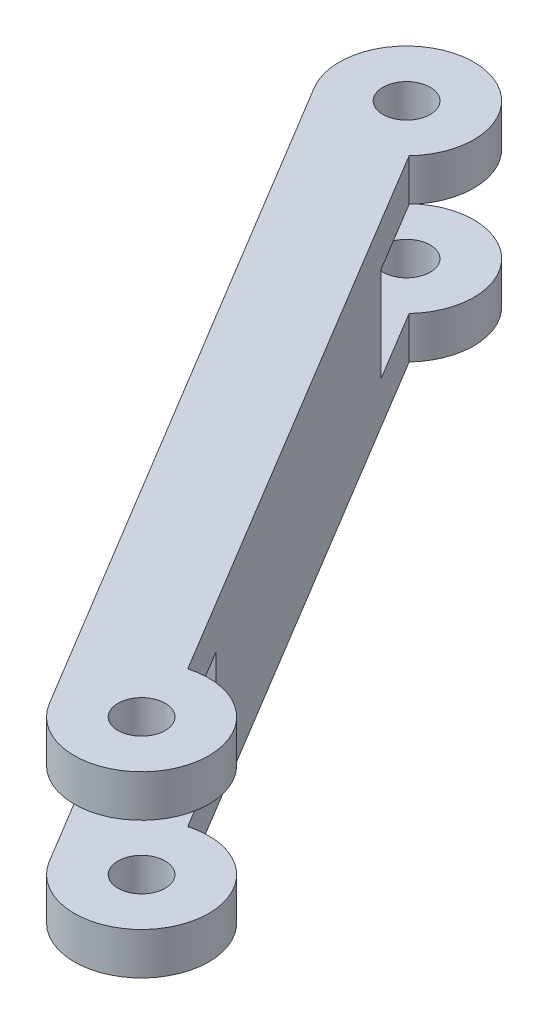
ISO-10303-21;
HEADER;
FILE_DESCRIPTION(('STEP AP214'),'2;1');
FILE_NAME('part.step','',(''),(''),'','','');
FILE_SCHEMA(('AUTOMOTIVE_DESIGN { 1 0 10303 214 1 1 1 1 }'));
ENDSEC;
DATA;
#1=APPLICATION_CONTEXT('core data for automotive mechanical design processes');
#2=APPLICATION_PROTOCOL_DEFINITION('international standard','automotive_design',2000,#1);
#3=PRODUCT_CONTEXT('',#1,'mechanical');
#4=PRODUCT('Part','Part','',(#3));
#5=PRODUCT_RELATED_PRODUCT_CATEGORY('part','',(#4));
#6=PRODUCT_DEFINITION_FORMATION('','',#4);
#7=PRODUCT_DEFINITION_CONTEXT('part definition',#1,'design');
#8=PRODUCT_DEFINITION('design','',#6,#7);
#9=PRODUCT_DEFINITION_SHAPE('','',#8);
#10=(LENGTH_UNIT() NAMED_UNIT(*) SI_UNIT(.MILLI.,.METRE.));
#11=(NAMED_UNIT(*) PLANE_ANGLE_UNIT() SI_UNIT($,.RADIAN.));
#12=(NAMED_UNIT(*) SI_UNIT($,.STERADIAN.) SOLID_ANGLE_UNIT());
#13=UNCERTAINTY_MEASURE_WITH_UNIT(LENGTH_MEASURE(1.E-05),#10,'distance_accuracy_value','');
#14=(GEOMETRIC_REPRESENTATION_CONTEXT(3) GLOBAL_UNCERTAINTY_ASSIGNED_CONTEXT((#13)) GLOBAL_UNIT_ASSIGNED_CONTEXT((#10,
#11,#12)) REPRESENTATION_CONTEXT('',''));
#15=CARTESIAN_POINT('',(0.,0.,0.));
#16=DIRECTION('',(0.,0.,1.));
#17=DIRECTION('',(1.,0.,0.));
#18=AXIS2_PLACEMENT_3D('',#15,#16,#17);
#19=CARTESIAN_POINT('',(1.41642843112484,8.5,-8.08146391959042));
#20=DIRECTION('',(0.,-1.,0.));
#21=DIRECTION('',(0.,0.,-1.));
#22=AXIS2_PLACEMENT_3D('',#19,#20,#21);
#23=CYLINDRICAL_SURFACE('',#22,3.2);
#24=DIRECTION('',(0.,-1.,0.));
#25=VECTOR('',#24,1.);
#26=CARTESIAN_POINT('',(-1.3249993249638,8.5,-6.43083559736074));
#27=LINE('',#26,#25);
#28=CARTESIAN_POINT('',(-1.3249993249638,8.5,-6.43083559736074));
#29=VERTEX_POINT('',#28);
#30=CARTESIAN_POINT('',(-1.3249993249638,6.5,-6.43083559736074));
#31=VERTEX_POINT('',#30);
#32=EDGE_CURVE('E219',#29,#31,#27,.T.);
#33=ORIENTED_EDGE('',*,*,#32,.T.);
#34=CARTESIAN_POINT('',(1.41642843112484,6.5,-8.08146391959042));
#35=DIRECTION('',(0.,1.,0.));
#36=DIRECTION('',(0.,0.,1.));
#37=AXIS2_PLACEMENT_3D('',#34,#35,#36);
#38=CIRCLE('',#37,3.2);
#39=CARTESIAN_POINT('',(0.535312802680835,6.5,-11.1577661234241));
#40=VERTEX_POINT('',#39);
#41=EDGE_CURVE('E153',#31,#40,#38,.T.);
#42=ORIENTED_EDGE('',*,*,#41,.T.);
#43=DIRECTION('',(0.,-1.,0.));
#44=VECTOR('',#43,1.);
#45=CARTESIAN_POINT('',(0.535312802680837,8.5,-11.1577661234241));
#46=LINE('',#45,#44);
#47=CARTESIAN_POINT('',(0.535312802680837,8.5,-11.1577661234241));
#48=VERTEX_POINT('',#47);
#49=EDGE_CURVE('E216',#48,#40,#46,.T.);
#50=ORIENTED_EDGE('',*,*,#49,.F.);
#51=CARTESIAN_POINT('',(1.41642843112484,8.5,-8.08146391959042));
#52=DIRECTION('',(0.,1.,0.));
#53=DIRECTION('',(0.,0.,1.));
#54=AXIS2_PLACEMENT_3D('',#51,#52,#53);
#55=CIRCLE('',#54,3.2);
#56=EDGE_CURVE('E198',#29,#48,#55,.T.);
#57=ORIENTED_EDGE('',*,*,#56,.F.);
#58=EDGE_LOOP('',(#33,#42,#50,#57));
#59=FACE_BOUND('',#58,.T.);
#60=ADVANCED_FACE('F33',(#59),#23,.T.);
#61=CARTESIAN_POINT('',(1.41642843112484,8.5,-8.08146391959042));
#62=DIRECTION('',(0.,-1.,0.));
#63=DIRECTION('',(0.,0.,-1.));
#64=AXIS2_PLACEMENT_3D('',#61,#62,#63);
#65=CYLINDRICAL_SURFACE('',#64,1.125);
#66=CARTESIAN_POINT('',(1.41642843112484,6.5,-8.08146391959042));
#67=DIRECTION('',(0.,1.,0.));
#68=DIRECTION('',(0.,0.,1.));
#69=AXIS2_PLACEMENT_3D('',#66,#67,#68);
#70=CIRCLE('',#69,1.125);
#71=CARTESIAN_POINT('',(1.41642843112484,6.5,-6.95646391959042));
#72=VERTEX_POINT('',#71);
#73=EDGE_CURVE('E149',#72,#72,#70,.T.);
#74=ORIENTED_EDGE('',*,*,#73,.F.);
#75=EDGE_LOOP('',(#74));
#76=FACE_BOUND('',#75,.T.);
#77=CARTESIAN_POINT('',(1.41642843112484,8.5,-8.08146391959042));
#78=DIRECTION('',(0.,1.,0.));
#79=DIRECTION('',(0.,0.,1.));
#80=AXIS2_PLACEMENT_3D('',#77,#78,#79);
#81=CIRCLE('',#80,1.125);
#82=CARTESIAN_POINT('',(1.41642843112484,8.5,-6.95646391959042));
#83=VERTEX_POINT('',#82);
#84=EDGE_CURVE('E180',#83,#83,#81,.T.);
#85=ORIENTED_EDGE('',*,*,#84,.T.);
#86=EDGE_LOOP('',(#85));
#87=FACE_BOUND('',#86,.T.);
#88=ADVANCED_FACE('F239',(#76,#87),#65,.F.);
#89=CARTESIAN_POINT('',(-17.6680765415417,8.5,-39.7777525017511));
#90=DIRECTION('',(0.,-1.,0.));
#91=DIRECTION('',(0.,0.,-1.));
#92=AXIS2_PLACEMENT_3D('',#89,#90,#91);
#93=CYLINDRICAL_SURFACE('',#92,3.2);
#94=DIRECTION('',(0.,-1.,0.));
#95=VECTOR('',#94,1.);
#96=CARTESIAN_POINT('',(-20.4095042976304,8.5,-38.1271241795214));
#97=LINE('',#96,#95);
#98=CARTESIAN_POINT('',(-20.4095042976304,2.,-38.1271241795214));
#99=VERTEX_POINT('',#98);
#100=CARTESIAN_POINT('',(-20.4095042976304,0.,-38.1271241795214));
#101=VERTEX_POINT('',#100);
#102=EDGE_CURVE('E222',#99,#101,#97,.T.);
#103=ORIENTED_EDGE('',*,*,#102,.F.);
#104=CARTESIAN_POINT('',(-17.6680765415417,2.,-39.7777525017511));
#105=DIRECTION('',(0.,-1.,0.));
#106=DIRECTION('',(0.,0.,-1.));
#107=AXIS2_PLACEMENT_3D('',#104,#105,#106);
#108=CIRCLE('',#107,3.2);
#109=CARTESIAN_POINT('',(-15.3458369949632,2.,-37.5761159540197));
#110=VERTEX_POINT('',#109);
#111=EDGE_CURVE('E176',#99,#110,#108,.T.);
#112=ORIENTED_EDGE('',*,*,#111,.T.);
#113=DIRECTION('',(0.,-1.,0.));
#114=VECTOR('',#113,1.);
#115=CARTESIAN_POINT('',(-15.3458369949632,8.5,-37.5761159540197));
#116=LINE('',#115,#114);
#117=CARTESIAN_POINT('',(-15.3458369949632,0.,-37.5761159540197));
#118=VERTEX_POINT('',#117);
#119=EDGE_CURVE('E202',#110,#118,#116,.T.);
#120=ORIENTED_EDGE('',*,*,#119,.T.);
#121=CARTESIAN_POINT('',(-17.6680765415417,0.,-39.7777525017511));
#122=DIRECTION('',(0.,1.,0.));
#123=DIRECTION('',(0.,0.,1.));
#124=AXIS2_PLACEMENT_3D('',#121,#122,#123);
#125=CIRCLE('',#124,3.2);
#126=EDGE_CURVE('E189',#118,#101,#125,.T.);
#127=ORIENTED_EDGE('',*,*,#126,.T.);
#128=EDGE_LOOP('',(#103,#112,#120,#127));
#129=FACE_BOUND('',#128,.T.);
#130=ADVANCED_FACE('F242',(#129),#93,.T.);
#131=CARTESIAN_POINT('',(-17.6680765415417,8.5,-39.7777525017511));
#132=DIRECTION('',(0.,-1.,0.));
#133=DIRECTION('',(0.,0.,-1.));
#134=AXIS2_PLACEMENT_3D('',#131,#132,#133);
#135=CYLINDRICAL_SURFACE('',#134,1.125);
#136=CARTESIAN_POINT('',(-17.6680765415417,2.,-39.7777525017511));
#137=DIRECTION('',(0.,-1.,0.));
#138=DIRECTION('',(0.,0.,-1.));
#139=AXIS2_PLACEMENT_3D('',#136,#137,#138);
#140=CIRCLE('',#139,1.125);
#141=CARTESIAN_POINT('',(-17.6680765415417,2.,-40.9027525017511));
#142=VERTEX_POINT('',#141);
#143=EDGE_CURVE('E172',#142,#142,#140,.T.);
#144=ORIENTED_EDGE('',*,*,#143,.F.);
#145=EDGE_LOOP('',(#144));
#146=FACE_BOUND('',#145,.T.);
#147=CARTESIAN_POINT('',(-17.6680765415417,0.,-39.7777525017511));
#148=DIRECTION('',(0.,1.,0.));
#149=DIRECTION('',(0.,0.,1.));
#150=AXIS2_PLACEMENT_3D('',#147,#148,#149);
#151=CIRCLE('',#150,1.125);
#152=CARTESIAN_POINT('',(-17.6680765415417,0.,-38.6527525017511));
#153=VERTEX_POINT('',#152);
#154=EDGE_CURVE('E183',#153,#153,#151,.T.);
#155=ORIENTED_EDGE('',*,*,#154,.F.);
#156=EDGE_LOOP('',(#155));
#157=FACE_BOUND('',#156,.T.);
#158=ADVANCED_FACE('F250',(#146,#157),#135,.F.);
#159=CARTESIAN_POINT('',(-17.6680765415417,8.5,-39.7777525017511));
#160=DIRECTION('',(0.,1.,0.));
#161=DIRECTION('',(0.,0.,1.));
#162=AXIS2_PLACEMENT_3D('',#159,#160,#161);
#163=PLANE('',#162);
#164=CARTESIAN_POINT('',(-17.6680765415417,8.5,-39.7777525017511));
#165=DIRECTION('',(0.,1.,0.));
#166=DIRECTION('',(0.,0.,1.));
#167=AXIS2_PLACEMENT_3D('',#164,#165,#166);
#168=CIRCLE('',#167,1.125);
#169=CARTESIAN_POINT('',(-17.6680765415417,8.5,-38.6527525017511));
#170=VERTEX_POINT('',#169);
#171=EDGE_CURVE('E186',#170,#170,#168,.T.);
#172=ORIENTED_EDGE('',*,*,#171,.F.);
#173=EDGE_LOOP('',(#172));
#174=FACE_BOUND('',#173,.T.);
#175=CARTESIAN_POINT('',(-17.6680765415417,8.5,-39.7777525017511));
#176=DIRECTION('',(0.,1.,0.));
#177=DIRECTION('',(0.,0.,1.));
#178=AXIS2_PLACEMENT_3D('',#175,#176,#177);
#179=CIRCLE('',#178,3.2);
#180=CARTESIAN_POINT('',(-15.3458369949632,8.5,-37.5761159540197));
#181=VERTEX_POINT('',#180);
#182=CARTESIAN_POINT('',(-20.4095042976304,8.5,-38.1271241795214));
#183=VERTEX_POINT('',#182);
#184=EDGE_CURVE('E192',#181,#183,#179,.T.);
#185=ORIENTED_EDGE('',*,*,#184,.T.);
#186=DIRECTION('',(0.515821350696777,0.,0.856696173777701));
#187=VECTOR('',#186,1.);
#188=CARTESIAN_POINT('',(-20.4095042976304,8.5,-38.1271241795214));
#189=LINE('',#188,#187);
#190=EDGE_CURVE('E195',#183,#29,#189,.T.);
#191=ORIENTED_EDGE('',*,*,#190,.T.);
#192=ORIENTED_EDGE('',*,*,#56,.T.);
#193=DIRECTION('',(-0.515214541749468,0.,-0.857061244001784));
#194=VECTOR('',#193,1.);
#195=CARTESIAN_POINT('',(-15.3458369949632,8.5,-37.5761159540197));
#196=LINE('',#195,#194);
#197=EDGE_CURVE('E200',#48,#181,#196,.T.);
#198=ORIENTED_EDGE('',*,*,#197,.T.);
#199=EDGE_LOOP('',(#185,#191,#192,#198));
#200=FACE_BOUND('',#199,.T.);
#201=ORIENTED_EDGE('',*,*,#84,.F.);
#202=EDGE_LOOP('',(#201));
#203=FACE_BOUND('',#202,.T.);
#204=ADVANCED_FACE('F247',(#174,#200,#203),#163,.T.);
#205=CARTESIAN_POINT('',(-17.6680765415417,0.,-39.7777525017511));
#206=DIRECTION('',(0.,1.,0.));
#207=DIRECTION('',(0.,0.,1.));
#208=AXIS2_PLACEMENT_3D('',#205,#206,#207);
#209=PLANE('',#208);
#210=ORIENTED_EDGE('',*,*,#126,.F.);
#211=DIRECTION('',(-0.515214541749468,0.,-0.857061244001784));
#212=VECTOR('',#211,1.);
#213=CARTESIAN_POINT('',(-15.3458369949632,0.,-37.5761159540197));
#214=LINE('',#213,#212);
#215=CARTESIAN_POINT('',(0.535312802680837,0.,-11.1577661234241));
#216=VERTEX_POINT('',#215);
#217=EDGE_CURVE('E196',#216,#118,#214,.T.);
#218=ORIENTED_EDGE('',*,*,#217,.F.);
#219=CARTESIAN_POINT('',(1.41642843112484,0.,-8.08146391959042));
#220=DIRECTION('',(0.,1.,0.));
#221=DIRECTION('',(0.,0.,1.));
#222=AXIS2_PLACEMENT_3D('',#219,#220,#221);
#223=CIRCLE('',#222,3.2);
#224=CARTESIAN_POINT('',(-1.3249993249638,0.,-6.43083559736074));
#225=VERTEX_POINT('',#224);
#226=EDGE_CURVE('E207',#225,#216,#223,.T.);
#227=ORIENTED_EDGE('',*,*,#226,.F.);
#228=DIRECTION('',(0.515821350696777,0.,0.856696173777701));
#229=VECTOR('',#228,1.);
#230=CARTESIAN_POINT('',(-20.4095042976304,0.,-38.1271241795214));
#231=LINE('',#230,#229);
#232=EDGE_CURVE('E205',#101,#225,#231,.T.);
#233=ORIENTED_EDGE('',*,*,#232,.F.);
#234=EDGE_LOOP('',(#210,#218,#227,#233));
#235=FACE_BOUND('',#234,.T.);
#236=ORIENTED_EDGE('',*,*,#154,.T.);
#237=EDGE_LOOP('',(#236));
#238=FACE_BOUND('',#237,.T.);
#239=CARTESIAN_POINT('',(1.41642843112484,0.,-8.08146391959042));
#240=DIRECTION('',(0.,1.,0.));
#241=DIRECTION('',(0.,0.,1.));
#242=AXIS2_PLACEMENT_3D('',#239,#240,#241);
#243=CIRCLE('',#242,1.125);
#244=CARTESIAN_POINT('',(1.41642843112484,0.,-6.95646391959042));
#245=VERTEX_POINT('',#244);
#246=EDGE_CURVE('E179',#245,#245,#243,.T.);
#247=ORIENTED_EDGE('',*,*,#246,.T.);
#248=EDGE_LOOP('',(#247));
#249=FACE_BOUND('',#248,.T.);
#250=ADVANCED_FACE('F249',(#235,#238,#249),#209,.F.);
#251=CARTESIAN_POINT('',(-15.3458369949632,6.5,-37.5761159540197));
#252=VERTEX_POINT('',#251);
#253=EDGE_CURVE('E212',#181,#252,#116,.T.);
#254=ORIENTED_EDGE('',*,*,#253,.T.);
#255=CARTESIAN_POINT('',(-17.6680765415417,6.5,-39.7777525017511));
#256=DIRECTION('',(0.,1.,0.));
#257=DIRECTION('',(0.,0.,1.));
#258=AXIS2_PLACEMENT_3D('',#255,#256,#257);
#259=CIRCLE('',#258,3.2);
#260=CARTESIAN_POINT('',(-20.4095042976304,6.5,-38.1271241795214));
#261=VERTEX_POINT('',#260);
#262=EDGE_CURVE('E56',#252,#261,#259,.T.);
#263=ORIENTED_EDGE('',*,*,#262,.T.);
#264=EDGE_CURVE('E223',#183,#261,#97,.T.);
#265=ORIENTED_EDGE('',*,*,#264,.F.);
#266=ORIENTED_EDGE('',*,*,#184,.F.);
#267=EDGE_LOOP('',(#254,#263,#265,#266));
#268=FACE_BOUND('',#267,.T.);
#269=ADVANCED_FACE('F35',(#268),#93,.T.);
#270=CARTESIAN_POINT('',(-20.4095042976304,8.5,-38.1271241795214));
#271=DIRECTION('',(0.856696173777701,0.,-0.515821350696777));
#272=DIRECTION('',(-0.515821350696777,0.,-0.856696173777701));
#273=AXIS2_PLACEMENT_3D('',#270,#271,#272);
#274=PLANE('',#273);
#275=DIRECTION('',(0.,-1.,0.));
#276=VECTOR('',#275,1.);
#277=CARTESIAN_POINT('',(-4.93574877984124,6.5,-12.4277088138046));
#278=LINE('',#277,#276);
#279=CARTESIAN_POINT('',(-4.93574877984124,6.5,-12.4277088138046));
#280=VERTEX_POINT('',#279);
#281=CARTESIAN_POINT('',(-4.93574877984124,2.,-12.4277088138046));
#282=VERTEX_POINT('',#281);
#283=EDGE_CURVE('E131',#280,#282,#278,.T.);
#284=ORIENTED_EDGE('',*,*,#283,.F.);
#285=DIRECTION('',(-0.515821350696777,0.,-0.856696173777701));
#286=VECTOR('',#285,1.);
#287=CARTESIAN_POINT('',(-4.93574877984124,6.5,-12.4277088138046));
#288=LINE('',#287,#286);
#289=EDGE_CURVE('E128',#31,#280,#288,.T.);
#290=ORIENTED_EDGE('',*,*,#289,.F.);
#291=ORIENTED_EDGE('',*,*,#32,.F.);
#292=ORIENTED_EDGE('',*,*,#190,.F.);
#293=ORIENTED_EDGE('',*,*,#264,.T.);
#294=DIRECTION('',(-0.515821350696777,0.,-0.856696173777701));
#295=VECTOR('',#294,1.);
#296=CARTESIAN_POINT('',(-16.7987548427529,6.5,-32.1302509630775));
#297=LINE('',#296,#295);
#298=CARTESIAN_POINT('',(-16.7987548427529,6.5,-32.1302509630775));
#299=VERTEX_POINT('',#298);
#300=EDGE_CURVE('E159',#299,#261,#297,.T.);
#301=ORIENTED_EDGE('',*,*,#300,.F.);
#302=DIRECTION('',(0.,1.,0.));
#303=VECTOR('',#302,1.);
#304=CARTESIAN_POINT('',(-16.7987548427529,2.,-32.1302509630775));
#305=LINE('',#304,#303);
#306=CARTESIAN_POINT('',(-16.7987548427529,2.,-32.1302509630775));
#307=VERTEX_POINT('',#306);
#308=EDGE_CURVE('E156',#307,#299,#305,.T.);
#309=ORIENTED_EDGE('',*,*,#308,.F.);
#310=DIRECTION('',(0.515821350696777,0.,0.856696173777701));
#311=VECTOR('',#310,1.);
#312=CARTESIAN_POINT('',(-16.7987548427529,2.,-32.1302509630775));
#313=LINE('',#312,#311);
#314=EDGE_CURVE('E161',#99,#307,#313,.T.);
#315=ORIENTED_EDGE('',*,*,#314,.F.);
#316=ORIENTED_EDGE('',*,*,#102,.T.);
#317=ORIENTED_EDGE('',*,*,#232,.T.);
#318=CARTESIAN_POINT('',(-1.3249993249638,2.,-6.43083559736074));
#319=VERTEX_POINT('',#318);
#320=EDGE_CURVE('E141',#319,#225,#27,.T.);
#321=ORIENTED_EDGE('',*,*,#320,.F.);
#322=DIRECTION('',(0.515821350696777,0.,0.856696173777701));
#323=VECTOR('',#322,1.);
#324=CARTESIAN_POINT('',(-4.93574877984124,2.,-12.4277088138046));
#325=LINE('',#324,#323);
#326=EDGE_CURVE('E124',#282,#319,#325,.T.);
#327=ORIENTED_EDGE('',*,*,#326,.F.);
#328=EDGE_LOOP('',(#284,#290,#291,#292,#293,#301,#309,#315,#316,#317,#321,#327));
#329=FACE_BOUND('',#328,.T.);
#330=ADVANCED_FACE('F139',(#329),#274,.F.);
#331=CARTESIAN_POINT('',(0.535312802680837,2.,-11.1577661234241));
#332=VERTEX_POINT('',#331);
#333=EDGE_CURVE('E215',#332,#216,#46,.T.);
#334=ORIENTED_EDGE('',*,*,#333,.F.);
#335=CARTESIAN_POINT('',(1.41642843112484,2.,-8.08146391959042));
#336=DIRECTION('',(0.,-1.,0.));
#337=DIRECTION('',(0.,0.,-1.));
#338=AXIS2_PLACEMENT_3D('',#335,#336,#337);
#339=CIRCLE('',#338,3.2);
#340=EDGE_CURVE('E48',#332,#319,#339,.T.);
#341=ORIENTED_EDGE('',*,*,#340,.T.);
#342=ORIENTED_EDGE('',*,*,#320,.T.);
#343=ORIENTED_EDGE('',*,*,#226,.T.);
#344=EDGE_LOOP('',(#334,#341,#342,#343));
#345=FACE_BOUND('',#344,.T.);
#346=ADVANCED_FACE('F267',(#345),#23,.T.);
#347=CARTESIAN_POINT('',(-15.3458369949632,8.5,-37.5761159540197));
#348=DIRECTION('',(-0.857061244001784,0.,0.515214541749468));
#349=DIRECTION('',(0.515214541749468,0.,0.857061244001784));
#350=AXIS2_PLACEMENT_3D('',#347,#348,#349);
#351=PLANE('',#350);
#352=ORIENTED_EDGE('',*,*,#49,.T.);
#353=DIRECTION('',(-0.515214541749468,0.,-0.857061244001784));
#354=VECTOR('',#353,1.);
#355=CARTESIAN_POINT('',(-15.3458369949632,6.5,-37.5761159540197));
#356=LINE('',#355,#354);
#357=CARTESIAN_POINT('',(-1.47919996122526,6.5,-14.5089153546319));
#358=VERTEX_POINT('',#357);
#359=EDGE_CURVE('E150',#40,#358,#356,.T.);
#360=ORIENTED_EDGE('',*,*,#359,.T.);
#361=DIRECTION('',(0.,-1.,0.));
#362=VECTOR('',#361,1.);
#363=CARTESIAN_POINT('',(-1.47919996122526,8.5,-14.5089153546319));
#364=LINE('',#363,#362);
#365=CARTESIAN_POINT('',(-1.47919996122526,2.,-14.5089153546319));
#366=VERTEX_POINT('',#365);
#367=EDGE_CURVE('E11',#358,#366,#364,.T.);
#368=ORIENTED_EDGE('',*,*,#367,.T.);
#369=DIRECTION('',(0.515214541749468,0.,0.857061244001784));
#370=VECTOR('',#369,1.);
#371=CARTESIAN_POINT('',(-15.3458369949632,2.,-37.5761159540197));
#372=LINE('',#371,#370);
#373=EDGE_CURVE('E125',#366,#332,#372,.T.);
#374=ORIENTED_EDGE('',*,*,#373,.T.);
#375=ORIENTED_EDGE('',*,*,#333,.T.);
#376=ORIENTED_EDGE('',*,*,#217,.T.);
#377=ORIENTED_EDGE('',*,*,#119,.F.);
#378=DIRECTION('',(0.515214541749468,0.,0.857061244001784));
#379=VECTOR('',#378,1.);
#380=CARTESIAN_POINT('',(-15.3458369949632,2.,-37.5761159540197));
#381=LINE('',#380,#379);
#382=CARTESIAN_POINT('',(-13.3282534305717,2.,-34.2198584351554));
#383=VERTEX_POINT('',#382);
#384=EDGE_CURVE('E173',#110,#383,#381,.T.);
#385=ORIENTED_EDGE('',*,*,#384,.T.);
#386=DIRECTION('',(0.,1.,0.));
#387=VECTOR('',#386,1.);
#388=CARTESIAN_POINT('',(-13.3282534305717,8.5,-34.2198584351554));
#389=LINE('',#388,#387);
#390=CARTESIAN_POINT('',(-13.3282534305717,6.5,-34.2198584351554));
#391=VERTEX_POINT('',#390);
#392=EDGE_CURVE('E41',#383,#391,#389,.T.);
#393=ORIENTED_EDGE('',*,*,#392,.T.);
#394=DIRECTION('',(-0.515214541749468,0.,-0.857061244001784));
#395=VECTOR('',#394,1.);
#396=CARTESIAN_POINT('',(-15.3458369949632,6.5,-37.5761159540197));
#397=LINE('',#396,#395);
#398=EDGE_CURVE('E169',#391,#252,#397,.T.);
#399=ORIENTED_EDGE('',*,*,#398,.T.);
#400=ORIENTED_EDGE('',*,*,#253,.F.);
#401=ORIENTED_EDGE('',*,*,#197,.F.);
#402=EDGE_LOOP('',(#352,#360,#368,#374,#375,#376,#377,#385,#393,#399,#400,#401));
#403=FACE_BOUND('',#402,.T.);
#404=ADVANCED_FACE('F272',(#403),#351,.F.);
#405=CARTESIAN_POINT('',(-17.6680765415417,6.5,-39.7777525017511));
#406=DIRECTION('',(0.,1.,0.));
#407=DIRECTION('',(0.,0.,1.));
#408=AXIS2_PLACEMENT_3D('',#405,#406,#407);
#409=CIRCLE('',#408,1.125);
#410=CARTESIAN_POINT('',(-17.6680765415417,6.5,-38.6527525017511));
#411=VERTEX_POINT('',#410);
#412=EDGE_CURVE('E167',#411,#411,#409,.T.);
#413=ORIENTED_EDGE('',*,*,#412,.F.);
#414=EDGE_LOOP('',(#413));
#415=FACE_BOUND('',#414,.T.);
#416=ORIENTED_EDGE('',*,*,#171,.T.);
#417=EDGE_LOOP('',(#416));
#418=FACE_BOUND('',#417,.T.);
#419=ADVANCED_FACE('F261',(#415,#418),#135,.F.);
#420=CARTESIAN_POINT('',(1.41642843112484,2.,-8.08146391959042));
#421=DIRECTION('',(0.,-1.,0.));
#422=DIRECTION('',(0.,0.,-1.));
#423=AXIS2_PLACEMENT_3D('',#420,#421,#422);
#424=CIRCLE('',#423,1.125);
#425=CARTESIAN_POINT('',(1.41642843112484,2.,-9.20646391959043));
#426=VERTEX_POINT('',#425);
#427=EDGE_CURVE('E145',#426,#426,#424,.T.);
#428=ORIENTED_EDGE('',*,*,#427,.F.);
#429=EDGE_LOOP('',(#428));
#430=FACE_BOUND('',#429,.T.);
#431=ORIENTED_EDGE('',*,*,#246,.F.);
#432=EDGE_LOOP('',(#431));
#433=FACE_BOUND('',#432,.T.);
#434=ADVANCED_FACE('F244',(#430,#433),#65,.F.);
#435=CARTESIAN_POINT('',(-9.51683736564249,2.,-36.5147324440001));
#436=DIRECTION('',(0.515821350696777,0.,0.856696173777701));
#437=DIRECTION('',(0.856696173777701,0.,-0.515821350696777));
#438=AXIS2_PLACEMENT_3D('',#435,#436,#437);
#439=PLANE('',#438);
#440=DIRECTION('',(-0.856696173777701,0.,0.515821350696777));
#441=VECTOR('',#440,1.);
#442=CARTESIAN_POINT('',(-9.51683736564249,2.,-36.5147324440001));
#443=LINE('',#442,#441);
#444=EDGE_CURVE('E165',#383,#307,#443,.T.);
#445=ORIENTED_EDGE('',*,*,#444,.T.);
#446=ORIENTED_EDGE('',*,*,#308,.T.);
#447=DIRECTION('',(-0.856696173777701,0.,0.515821350696777));
#448=VECTOR('',#447,1.);
#449=CARTESIAN_POINT('',(-9.51683736564249,6.5,-36.5147324440001));
#450=LINE('',#449,#448);
#451=EDGE_CURVE('E164',#391,#299,#450,.T.);
#452=ORIENTED_EDGE('',*,*,#451,.F.);
#453=ORIENTED_EDGE('',*,*,#392,.F.);
#454=EDGE_LOOP('',(#445,#446,#452,#453));
#455=FACE_BOUND('',#454,.T.);
#456=ADVANCED_FACE('F297',(#455),#439,.F.);
#457=CARTESIAN_POINT('',(-9.51683736564249,2.,-36.5147324440001));
#458=DIRECTION('',(0.,-1.,0.));
#459=DIRECTION('',(0.,0.,-1.));
#460=AXIS2_PLACEMENT_3D('',#457,#458,#459);
#461=PLANE('',#460);
#462=ORIENTED_EDGE('',*,*,#143,.T.);
#463=EDGE_LOOP('',(#462));
#464=FACE_BOUND('',#463,.T.);
#465=ORIENTED_EDGE('',*,*,#314,.T.);
#466=ORIENTED_EDGE('',*,*,#444,.F.);
#467=ORIENTED_EDGE('',*,*,#384,.F.);
#468=ORIENTED_EDGE('',*,*,#111,.F.);
#469=EDGE_LOOP('',(#465,#466,#467,#468));
#470=FACE_BOUND('',#469,.T.);
#471=ADVANCED_FACE('F315',(#464,#470),#461,.F.);
#472=CARTESIAN_POINT('',(-9.51683736564249,6.5,-36.5147324440001));
#473=DIRECTION('',(0.,1.,0.));
#474=DIRECTION('',(0.,0.,1.));
#475=AXIS2_PLACEMENT_3D('',#472,#473,#474);
#476=PLANE('',#475);
#477=ORIENTED_EDGE('',*,*,#412,.T.);
#478=EDGE_LOOP('',(#477));
#479=FACE_BOUND('',#478,.T.);
#480=ORIENTED_EDGE('',*,*,#398,.F.);
#481=ORIENTED_EDGE('',*,*,#451,.T.);
#482=ORIENTED_EDGE('',*,*,#300,.T.);
#483=ORIENTED_EDGE('',*,*,#262,.F.);
#484=EDGE_LOOP('',(#480,#481,#482,#483));
#485=FACE_BOUND('',#484,.T.);
#486=ADVANCED_FACE('F295',(#479,#485),#476,.F.);
#487=CARTESIAN_POINT('',(2.34616869726922,6.5,-16.8121902947273));
#488=DIRECTION('',(-0.515821350696777,0.,-0.856696173777701));
#489=DIRECTION('',(-0.856696173777701,0.,0.515821350696777));
#490=AXIS2_PLACEMENT_3D('',#487,#488,#489);
#491=PLANE('',#490);
#492=DIRECTION('',(-0.856696173777701,0.,0.515821350696777));
#493=VECTOR('',#492,1.);
#494=CARTESIAN_POINT('',(2.34616869726922,6.5,-16.8121902947273));
#495=LINE('',#494,#493);
#496=EDGE_CURVE('E127',#358,#280,#495,.T.);
#497=ORIENTED_EDGE('',*,*,#496,.T.);
#498=ORIENTED_EDGE('',*,*,#283,.T.);
#499=DIRECTION('',(-0.856696173777701,0.,0.515821350696777));
#500=VECTOR('',#499,1.);
#501=CARTESIAN_POINT('',(2.34616869726922,2.,-16.8121902947273));
#502=LINE('',#501,#500);
#503=EDGE_CURVE('E120',#366,#282,#502,.T.);
#504=ORIENTED_EDGE('',*,*,#503,.F.);
#505=ORIENTED_EDGE('',*,*,#367,.F.);
#506=EDGE_LOOP('',(#497,#498,#504,#505));
#507=FACE_BOUND('',#506,.T.);
#508=ADVANCED_FACE('F132',(#507),#491,.F.);
#509=CARTESIAN_POINT('',(2.34616869726922,6.5,-16.8121902947273));
#510=DIRECTION('',(0.,1.,0.));
#511=DIRECTION('',(0.,0.,1.));
#512=AXIS2_PLACEMENT_3D('',#509,#510,#511);
#513=PLANE('',#512);
#514=ORIENTED_EDGE('',*,*,#73,.T.);
#515=EDGE_LOOP('',(#514));
#516=FACE_BOUND('',#515,.T.);
#517=ORIENTED_EDGE('',*,*,#289,.T.);
#518=ORIENTED_EDGE('',*,*,#496,.F.);
#519=ORIENTED_EDGE('',*,*,#359,.F.);
#520=ORIENTED_EDGE('',*,*,#41,.F.);
#521=EDGE_LOOP('',(#517,#518,#519,#520));
#522=FACE_BOUND('',#521,.T.);
#523=ADVANCED_FACE('F236',(#516,#522),#513,.F.);
#524=CARTESIAN_POINT('',(2.34616869726922,2.,-16.8121902947273));
#525=DIRECTION('',(0.,-1.,0.));
#526=DIRECTION('',(0.,0.,-1.));
#527=AXIS2_PLACEMENT_3D('',#524,#525,#526);
#528=PLANE('',#527);
#529=ORIENTED_EDGE('',*,*,#427,.T.);
#530=EDGE_LOOP('',(#529));
#531=FACE_BOUND('',#530,.T.);
#532=ORIENTED_EDGE('',*,*,#373,.F.);
#533=ORIENTED_EDGE('',*,*,#503,.T.);
#534=ORIENTED_EDGE('',*,*,#326,.T.);
#535=ORIENTED_EDGE('',*,*,#340,.F.);
#536=EDGE_LOOP('',(#532,#533,#534,#535));
#537=FACE_BOUND('',#536,.T.);
#538=ADVANCED_FACE('F122',(#531,#537),#528,.F.);
#539=CLOSED_SHELL('',(#60,#88,#130,#158,#204,#250,#269,#330,#346,#404,#419,#434,#456,#471,#486,
#508,#523,#538));
#540=MANIFOLD_SOLID_BREP('B2',#539);
#541=ADVANCED_BREP_SHAPE_REPRESENTATION('',(#18,#540),#14);
#542=SHAPE_DEFINITION_REPRESENTATION(#9,#541);
ENDSEC;
END-ISO-10303-21;
